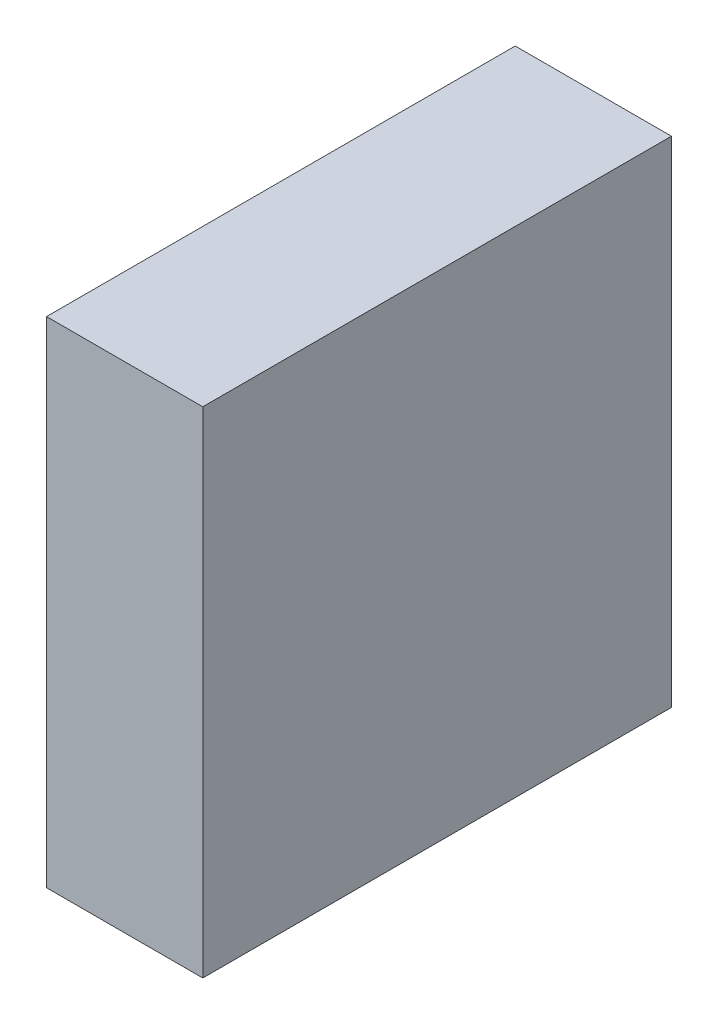
ISO-10303-21;
HEADER;
FILE_DESCRIPTION(('STEP AP214'),'2;1');
FILE_NAME('part.step','',(''),(''),'','','');
FILE_SCHEMA(('AUTOMOTIVE_DESIGN { 1 0 10303 214 1 1 1 1 }'));
ENDSEC;
DATA;
#1=APPLICATION_CONTEXT('core data for automotive mechanical design processes');
#2=APPLICATION_PROTOCOL_DEFINITION('international standard','automotive_design',2000,#1);
#3=PRODUCT_CONTEXT('',#1,'mechanical');
#4=PRODUCT('Part','Part','',(#3));
#5=PRODUCT_RELATED_PRODUCT_CATEGORY('part','',(#4));
#6=PRODUCT_DEFINITION_FORMATION('','',#4);
#7=PRODUCT_DEFINITION_CONTEXT('part definition',#1,'design');
#8=PRODUCT_DEFINITION('design','',#6,#7);
#9=PRODUCT_DEFINITION_SHAPE('','',#8);
#10=(LENGTH_UNIT() NAMED_UNIT(*) SI_UNIT(.MILLI.,.METRE.));
#11=(NAMED_UNIT(*) PLANE_ANGLE_UNIT() SI_UNIT($,.RADIAN.));
#12=(NAMED_UNIT(*) SI_UNIT($,.STERADIAN.) SOLID_ANGLE_UNIT());
#13=UNCERTAINTY_MEASURE_WITH_UNIT(LENGTH_MEASURE(1.E-05),#10,'distance_accuracy_value','');
#14=(GEOMETRIC_REPRESENTATION_CONTEXT(3) GLOBAL_UNCERTAINTY_ASSIGNED_CONTEXT((#13)) GLOBAL_UNIT_ASSIGNED_CONTEXT((#10,
#11,#12)) REPRESENTATION_CONTEXT('',''));
#15=CARTESIAN_POINT('',(0.,0.,0.));
#16=DIRECTION('',(0.,0.,1.));
#17=DIRECTION('',(1.,0.,0.));
#18=AXIS2_PLACEMENT_3D('',#15,#16,#17);
#19=CARTESIAN_POINT('',(0.1499997,0.47500032,0.));
#20=DIRECTION('',(1.,0.,0.));
#21=DIRECTION('',(0.,-1.,0.));
#22=AXIS2_PLACEMENT_3D('',#19,#20,#21);
#23=PLANE('',#22);
#24=DIRECTION('',(0.,0.,1.));
#25=VECTOR('',#24,1.);
#26=CARTESIAN_POINT('',(0.1499997,0.47500032,0.));
#27=LINE('',#26,#25);
#28=CARTESIAN_POINT('',(0.1499997,0.47500032,0.));
#29=VERTEX_POINT('',#28);
#30=CARTESIAN_POINT('',(0.1499997,0.47500032,0.90000074));
#31=VERTEX_POINT('',#30);
#32=EDGE_CURVE('E11',#29,#31,#27,.T.);
#33=ORIENTED_EDGE('',*,*,#32,.T.);
#34=DIRECTION('',(0.,-1.,0.));
#35=VECTOR('',#34,1.);
#36=CARTESIAN_POINT('',(0.1499997,0.47500032,0.90000074));
#37=LINE('',#36,#35);
#38=CARTESIAN_POINT('',(0.1499997,-0.47500032,0.90000074));
#39=VERTEX_POINT('',#38);
#40=EDGE_CURVE('E24',#31,#39,#37,.T.);
#41=ORIENTED_EDGE('',*,*,#40,.T.);
#42=DIRECTION('',(0.,0.,1.));
#43=VECTOR('',#42,1.);
#44=CARTESIAN_POINT('',(0.1499997,-0.47500032,0.));
#45=LINE('',#44,#43);
#46=CARTESIAN_POINT('',(0.1499997,-0.47500032,0.));
#47=VERTEX_POINT('',#46);
#48=EDGE_CURVE('E85',#47,#39,#45,.T.);
#49=ORIENTED_EDGE('',*,*,#48,.F.);
#50=DIRECTION('',(0.,-1.,0.));
#51=VECTOR('',#50,1.);
#52=CARTESIAN_POINT('',(0.1499997,0.47500032,0.));
#53=LINE('',#52,#51);
#54=EDGE_CURVE('E83',#29,#47,#53,.T.);
#55=ORIENTED_EDGE('',*,*,#54,.F.);
#56=EDGE_LOOP('',(#33,#41,#49,#55));
#57=FACE_BOUND('',#56,.T.);
#58=ADVANCED_FACE('F17',(#57),#23,.T.);
#59=CARTESIAN_POINT('',(0.1499997,-0.47500032,0.));
#60=DIRECTION('',(0.,-1.,0.));
#61=DIRECTION('',(-1.,0.,0.));
#62=AXIS2_PLACEMENT_3D('',#59,#60,#61);
#63=PLANE('',#62);
#64=ORIENTED_EDGE('',*,*,#48,.T.);
#65=DIRECTION('',(-1.,0.,0.));
#66=VECTOR('',#65,1.);
#67=CARTESIAN_POINT('',(0.1499997,-0.47500032,0.90000074));
#68=LINE('',#67,#66);
#69=CARTESIAN_POINT('',(-0.1499997,-0.47500032,0.90000074));
#70=VERTEX_POINT('',#69);
#71=EDGE_CURVE('E81',#39,#70,#68,.T.);
#72=ORIENTED_EDGE('',*,*,#71,.T.);
#73=DIRECTION('',(0.,0.,1.));
#74=VECTOR('',#73,1.);
#75=CARTESIAN_POINT('',(-0.1499997,-0.47500032,0.));
#76=LINE('',#75,#74);
#77=CARTESIAN_POINT('',(-0.1499997,-0.47500032,0.));
#78=VERTEX_POINT('',#77);
#79=EDGE_CURVE('E79',#78,#70,#76,.T.);
#80=ORIENTED_EDGE('',*,*,#79,.F.);
#81=DIRECTION('',(-1.,0.,0.));
#82=VECTOR('',#81,1.);
#83=CARTESIAN_POINT('',(0.1499997,-0.47500032,0.));
#84=LINE('',#83,#82);
#85=EDGE_CURVE('E70',#47,#78,#84,.T.);
#86=ORIENTED_EDGE('',*,*,#85,.F.);
#87=EDGE_LOOP('',(#64,#72,#80,#86));
#88=FACE_BOUND('',#87,.T.);
#89=ADVANCED_FACE('F90',(#88),#63,.T.);
#90=CARTESIAN_POINT('',(-0.1499997,-0.47500032,0.));
#91=DIRECTION('',(-1.,0.,0.));
#92=DIRECTION('',(0.,1.,0.));
#93=AXIS2_PLACEMENT_3D('',#90,#91,#92);
#94=PLANE('',#93);
#95=ORIENTED_EDGE('',*,*,#79,.T.);
#96=DIRECTION('',(0.,1.,0.));
#97=VECTOR('',#96,1.);
#98=CARTESIAN_POINT('',(-0.1499997,-0.47500032,0.90000074));
#99=LINE('',#98,#97);
#100=CARTESIAN_POINT('',(-0.1499997,0.47500032,0.90000074));
#101=VERTEX_POINT('',#100);
#102=EDGE_CURVE('E60',#70,#101,#99,.T.);
#103=ORIENTED_EDGE('',*,*,#102,.T.);
#104=DIRECTION('',(0.,0.,1.));
#105=VECTOR('',#104,1.);
#106=CARTESIAN_POINT('',(-0.1499997,0.47500032,0.));
#107=LINE('',#106,#105);
#108=CARTESIAN_POINT('',(-0.1499997,0.47500032,0.));
#109=VERTEX_POINT('',#108);
#110=EDGE_CURVE('E54',#109,#101,#107,.T.);
#111=ORIENTED_EDGE('',*,*,#110,.F.);
#112=DIRECTION('',(0.,1.,0.));
#113=VECTOR('',#112,1.);
#114=CARTESIAN_POINT('',(-0.1499997,-0.47500032,0.));
#115=LINE('',#114,#113);
#116=EDGE_CURVE('E58',#78,#109,#115,.T.);
#117=ORIENTED_EDGE('',*,*,#116,.F.);
#118=EDGE_LOOP('',(#95,#103,#111,#117));
#119=FACE_BOUND('',#118,.T.);
#120=ADVANCED_FACE('F57',(#119),#94,.T.);
#121=CARTESIAN_POINT('',(-0.1499997,0.47500032,0.));
#122=DIRECTION('',(0.,1.,0.));
#123=DIRECTION('',(1.,0.,0.));
#124=AXIS2_PLACEMENT_3D('',#121,#122,#123);
#125=PLANE('',#124);
#126=ORIENTED_EDGE('',*,*,#110,.T.);
#127=DIRECTION('',(1.,0.,0.));
#128=VECTOR('',#127,1.);
#129=CARTESIAN_POINT('',(-0.1499997,0.47500032,0.90000074));
#130=LINE('',#129,#128);
#131=EDGE_CURVE('E71',#101,#31,#130,.T.);
#132=ORIENTED_EDGE('',*,*,#131,.T.);
#133=ORIENTED_EDGE('',*,*,#32,.F.);
#134=DIRECTION('',(1.,0.,0.));
#135=VECTOR('',#134,1.);
#136=CARTESIAN_POINT('',(-0.1499997,0.47500032,0.));
#137=LINE('',#136,#135);
#138=EDGE_CURVE('E68',#109,#29,#137,.T.);
#139=ORIENTED_EDGE('',*,*,#138,.F.);
#140=EDGE_LOOP('',(#126,#132,#133,#139));
#141=FACE_BOUND('',#140,.T.);
#142=ADVANCED_FACE('F73',(#141),#125,.T.);
#143=CARTESIAN_POINT('',(0.,0.,0.));
#144=DIRECTION('',(0.,0.,-1.));
#145=DIRECTION('',(-1.,0.,0.));
#146=AXIS2_PLACEMENT_3D('',#143,#144,#145);
#147=PLANE('',#146);
#148=ORIENTED_EDGE('',*,*,#54,.T.);
#149=ORIENTED_EDGE('',*,*,#85,.T.);
#150=ORIENTED_EDGE('',*,*,#116,.T.);
#151=ORIENTED_EDGE('',*,*,#138,.T.);
#152=EDGE_LOOP('',(#148,#149,#150,#151));
#153=FACE_BOUND('',#152,.T.);
#154=ADVANCED_FACE('F67',(#153),#147,.T.);
#155=CARTESIAN_POINT('',(0.,0.,0.90000074));
#156=DIRECTION('',(0.,0.,-1.));
#157=DIRECTION('',(-1.,0.,0.));
#158=AXIS2_PLACEMENT_3D('',#155,#156,#157);
#159=PLANE('',#158);
#160=ORIENTED_EDGE('',*,*,#131,.F.);
#161=ORIENTED_EDGE('',*,*,#102,.F.);
#162=ORIENTED_EDGE('',*,*,#71,.F.);
#163=ORIENTED_EDGE('',*,*,#40,.F.);
#164=EDGE_LOOP('',(#160,#161,#162,#163));
#165=FACE_BOUND('',#164,.T.);
#166=ADVANCED_FACE('F91',(#165),#159,.F.);
#167=CLOSED_SHELL('',(#58,#89,#120,#142,#154,#166));
#168=MANIFOLD_SOLID_BREP('B1',#167);
#169=ADVANCED_BREP_SHAPE_REPRESENTATION('',(#18,#168),#14);
#170=SHAPE_DEFINITION_REPRESENTATION(#9,#169);
ENDSEC;
END-ISO-10303-21;
